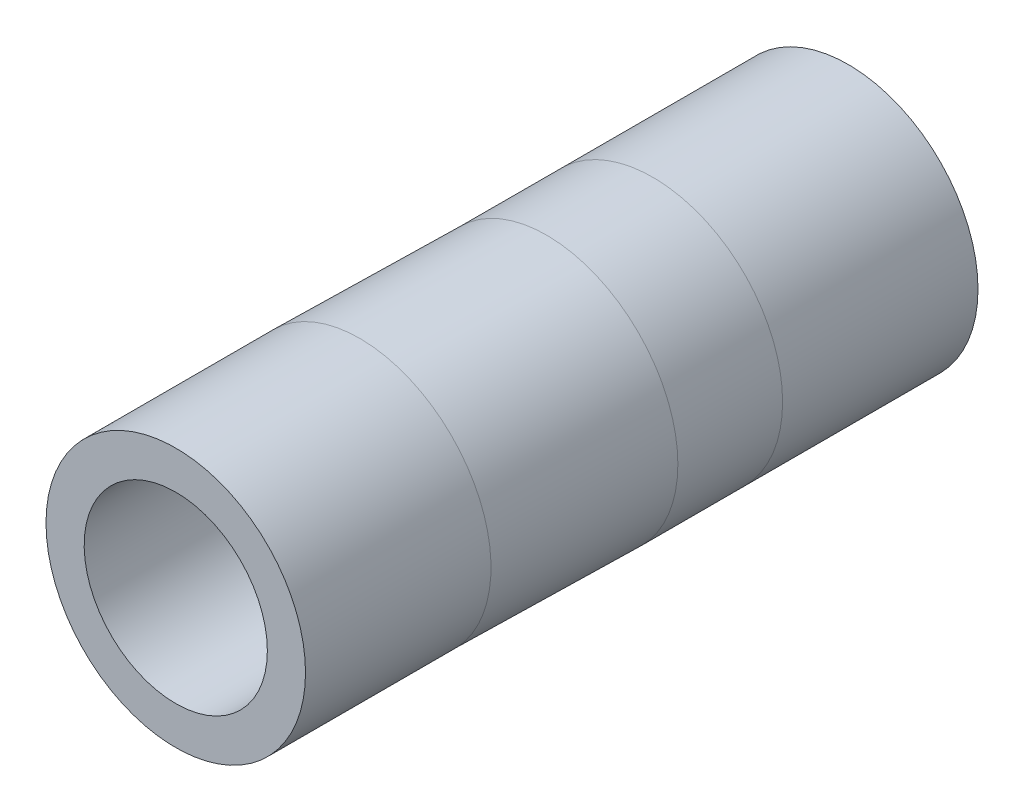
ISO-10303-21;
HEADER;
FILE_DESCRIPTION(('STEP AP214'),'2;1');
FILE_NAME('part.step','',(''),(''),'','','');
FILE_SCHEMA(('AUTOMOTIVE_DESIGN { 1 0 10303 214 1 1 1 1 }'));
ENDSEC;
DATA;
#1=APPLICATION_CONTEXT('core data for automotive mechanical design processes');
#2=APPLICATION_PROTOCOL_DEFINITION('international standard','automotive_design',2000,#1);
#3=PRODUCT_CONTEXT('',#1,'mechanical');
#4=PRODUCT('Part','Part','',(#3));
#5=PRODUCT_RELATED_PRODUCT_CATEGORY('part','',(#4));
#6=PRODUCT_DEFINITION_FORMATION('','',#4);
#7=PRODUCT_DEFINITION_CONTEXT('part definition',#1,'design');
#8=PRODUCT_DEFINITION('design','',#6,#7);
#9=PRODUCT_DEFINITION_SHAPE('','',#8);
#10=(LENGTH_UNIT() NAMED_UNIT(*) SI_UNIT(.MILLI.,.METRE.));
#11=(NAMED_UNIT(*) PLANE_ANGLE_UNIT() SI_UNIT($,.RADIAN.));
#12=(NAMED_UNIT(*) SI_UNIT($,.STERADIAN.) SOLID_ANGLE_UNIT());
#13=UNCERTAINTY_MEASURE_WITH_UNIT(LENGTH_MEASURE(1.E-05),#10,'distance_accuracy_value','');
#14=(GEOMETRIC_REPRESENTATION_CONTEXT(3) GLOBAL_UNCERTAINTY_ASSIGNED_CONTEXT((#13)) GLOBAL_UNIT_ASSIGNED_CONTEXT((#10,
#11,#12)) REPRESENTATION_CONTEXT('',''));
#15=CARTESIAN_POINT('',(0.,0.,0.));
#16=DIRECTION('',(0.,0.,1.));
#17=DIRECTION('',(1.,0.,0.));
#18=AXIS2_PLACEMENT_3D('',#15,#16,#17);
#19=CARTESIAN_POINT('',(-428.149950151648,-529.77578883125,-30.8991000000001));
#20=DIRECTION('',(0.,0.,1.));
#21=DIRECTION('',(1.,0.,0.));
#22=AXIS2_PLACEMENT_3D('',#19,#20,#21);
#23=PLANE('',#22);
#24=CARTESIAN_POINT('',(-428.149950151647,-529.77578883125,-30.8991000000001));
#25=DIRECTION('',(0.,0.,1.));
#26=DIRECTION('',(1.,0.,0.));
#27=AXIS2_PLACEMENT_3D('',#24,#25,#26);
#28=CIRCLE('',#27,9.52500000000001);
#29=CARTESIAN_POINT('',(-418.624950151647,-529.77578883125,-30.8991000000001));
#30=VERTEX_POINT('',#29);
#31=EDGE_CURVE('E98',#30,#30,#28,.T.);
#32=ORIENTED_EDGE('',*,*,#31,.T.);
#33=EDGE_LOOP('',(#32));
#34=FACE_BOUND('',#33,.T.);
#35=CARTESIAN_POINT('',(-428.149950151648,-529.77578883125,-30.8991000000001));
#36=DIRECTION('',(0.,0.,1.));
#37=DIRECTION('',(1.,0.,0.));
#38=AXIS2_PLACEMENT_3D('',#35,#36,#37);
#39=CIRCLE('',#38,13.49375);
#40=CARTESIAN_POINT('',(-414.656200151648,-529.77578883125,-30.8991000000001));
#41=VERTEX_POINT('',#40);
#42=EDGE_CURVE('E81',#41,#41,#39,.T.);
#43=ORIENTED_EDGE('',*,*,#42,.F.);
#44=EDGE_LOOP('',(#43));
#45=FACE_BOUND('',#44,.T.);
#46=ADVANCED_FACE('F60',(#34,#45),#23,.F.);
#47=CARTESIAN_POINT('',(-429.012409580605,-530.218903581321,38.1706173179638));
#48=DIRECTION('',(0.,0.,1.));
#49=DIRECTION('',(1.,0.,0.));
#50=AXIS2_PLACEMENT_3D('',#47,#48,#49);
#51=PLANE('',#50);
#52=CARTESIAN_POINT('',(-429.012409580605,-530.218903581321,38.1706173179638));
#53=DIRECTION('',(0.,0.,1.));
#54=DIRECTION('',(1.,0.,0.));
#55=AXIS2_PLACEMENT_3D('',#52,#53,#54);
#56=CIRCLE('',#55,9.52500000000001);
#57=CARTESIAN_POINT('',(-419.487409580605,-530.218903581321,38.1706173179638));
#58=VERTEX_POINT('',#57);
#59=EDGE_CURVE('E84',#58,#58,#56,.T.);
#60=ORIENTED_EDGE('',*,*,#59,.F.);
#61=EDGE_LOOP('',(#60));
#62=FACE_BOUND('',#61,.T.);
#63=CARTESIAN_POINT('',(-429.012409580605,-530.218903581321,38.1706173179638));
#64=DIRECTION('',(0.,0.,1.));
#65=DIRECTION('',(1.,0.,0.));
#66=AXIS2_PLACEMENT_3D('',#63,#64,#65);
#67=CIRCLE('',#66,13.49375);
#68=CARTESIAN_POINT('',(-415.518659580605,-530.218903581321,38.1706173179638));
#69=VERTEX_POINT('',#68);
#70=EDGE_CURVE('E68',#69,#69,#67,.T.);
#71=ORIENTED_EDGE('',*,*,#70,.T.);
#72=EDGE_LOOP('',(#71));
#73=FACE_BOUND('',#72,.T.);
#74=ADVANCED_FACE('F152',(#62,#73),#51,.T.);
#75=CARTESIAN_POINT('',(-428.149950151647,-529.77578883125,0.798429806321475));
#76=DIRECTION('',(0.,0.,-1.));
#77=DIRECTION('',(-1.,0.,0.));
#78=AXIS2_PLACEMENT_3D('',#75,#76,#77);
#79=CYLINDRICAL_SURFACE('',#78,13.49375);
#80=CARTESIAN_POINT('',(-428.149950151647,-529.77578883125,0.));
#81=DIRECTION('',(0.0231993471081752,0.0119193698283223,-0.999659801590846));
#82=DIRECTION('',(0.889167937515806,0.456837058271916,0.0260821985911831));
#83=AXIS2_PLACEMENT_3D('',#80,#81,#82);
#84=ELLIPSE('',#83,13.4983421145135,13.49375);
#85=CARTESIAN_POINT('',(-416.147657133802,-523.609245928107,0.352066439682501));
#86=VERTEX_POINT('',#85);
#87=EDGE_CURVE('E75',#86,#86,#84,.T.);
#88=ORIENTED_EDGE('',*,*,#87,.T.);
#89=EDGE_LOOP('',(#88));
#90=FACE_BOUND('',#89,.T.);
#91=CARTESIAN_POINT('',(-428.149950151647,-529.77578883125,-10.5791000000137));
#92=DIRECTION('',(0.,0.,1.));
#93=DIRECTION('',(1.,0.,0.));
#94=AXIS2_PLACEMENT_3D('',#91,#92,#93);
#95=CIRCLE('',#94,13.49375);
#96=CARTESIAN_POINT('',(-414.656200151647,-529.77578883125,-10.5791000000137));
#97=VERTEX_POINT('',#96);
#98=EDGE_CURVE('E63',#97,#97,#95,.T.);
#99=ORIENTED_EDGE('',*,*,#98,.T.);
#100=EDGE_LOOP('',(#99));
#101=FACE_BOUND('',#100,.T.);
#102=ADVANCED_FACE('F150',(#90,#101),#79,.T.);
#103=CARTESIAN_POINT('',(-428.149950151648,-529.77578883125,-10.5791));
#104=DIRECTION('',(0.,0.,-1.));
#105=DIRECTION('',(-1.,0.,0.));
#106=AXIS2_PLACEMENT_3D('',#103,#104,#105);
#107=CYLINDRICAL_SURFACE('',#106,13.49375);
#108=ORIENTED_EDGE('',*,*,#42,.T.);
#109=EDGE_LOOP('',(#108));
#110=FACE_BOUND('',#109,.T.);
#111=ORIENTED_EDGE('',*,*,#98,.F.);
#112=EDGE_LOOP('',(#111));
#113=FACE_BOUND('',#112,.T.);
#114=ADVANCED_FACE('F142',(#110,#113),#107,.T.);
#115=CARTESIAN_POINT('',(-429.049443078017,-530.237930666421,19.3663813005893));
#116=DIRECTION('',(0.0463829094544121,0.0238306297553371,-0.998639437833299));
#117=DIRECTION('',(-0.998923121793258,0.,-0.046396085468627));
#118=AXIS2_PLACEMENT_3D('',#115,#116,#117);
#119=CYLINDRICAL_SURFACE('',#118,13.49375);
#120=CARTESIAN_POINT('',(-429.012409580605,-530.218903581321,18.5690378076546));
#121=DIRECTION('',(0.0231993471081885,0.0119193698283194,-0.999659801590846));
#122=DIRECTION('',(-0.889167937515655,-0.45683705827221,-0.0260821985911937));
#123=AXIS2_PLACEMENT_3D('',#120,#121,#122);
#124=ELLIPSE('',#123,13.4983421145135,13.49375);
#125=CARTESIAN_POINT('',(-441.014702598448,-536.385446484468,18.216971367972));
#126=VERTEX_POINT('',#125);
#127=EDGE_CURVE('E11',#126,#126,#124,.T.);
#128=ORIENTED_EDGE('',*,*,#127,.T.);
#129=EDGE_LOOP('',(#128));
#130=FACE_BOUND('',#129,.T.);
#131=ORIENTED_EDGE('',*,*,#87,.F.);
#132=EDGE_LOOP('',(#131));
#133=FACE_BOUND('',#132,.T.);
#134=ADVANCED_FACE('F136',(#130,#133),#119,.T.);
#135=CARTESIAN_POINT('',(-429.012409580605,-530.218903581321,38.1706173179638));
#136=DIRECTION('',(0.,0.,-1.));
#137=DIRECTION('',(-1.,0.,0.));
#138=AXIS2_PLACEMENT_3D('',#135,#136,#137);
#139=CYLINDRICAL_SURFACE('',#138,13.49375);
#140=ORIENTED_EDGE('',*,*,#70,.F.);
#141=EDGE_LOOP('',(#140));
#142=FACE_BOUND('',#141,.T.);
#143=ORIENTED_EDGE('',*,*,#127,.F.);
#144=EDGE_LOOP('',(#143));
#145=FACE_BOUND('',#144,.T.);
#146=ADVANCED_FACE('F131',(#142,#145),#139,.T.);
#147=CARTESIAN_POINT('',(-429.012409580605,-530.218903581321,43.1706173179685));
#148=DIRECTION('',(0.,0.,-1.));
#149=DIRECTION('',(-1.,0.,0.));
#150=AXIS2_PLACEMENT_3D('',#147,#148,#149);
#151=CYLINDRICAL_SURFACE('',#150,9.52500000000001);
#152=CARTESIAN_POINT('',(-429.012409580605,-530.218903581321,18.5690378076546));
#153=DIRECTION('',(0.0231993471081891,0.0119193698283223,-0.999659801590846));
#154=DIRECTION('',(-0.889167937515624,-0.456837058272269,-0.0260821985911955));
#155=AXIS2_PLACEMENT_3D('',#152,#153,#154);
#156=ELLIPSE('',#155,9.52824149259782,9.52500000000001);
#157=CARTESIAN_POINT('',(-437.484616416729,-534.571757395308,18.3205203208198));
#158=VERTEX_POINT('',#157);
#159=EDGE_CURVE('E92',#158,#158,#156,.T.);
#160=ORIENTED_EDGE('',*,*,#159,.T.);
#161=EDGE_LOOP('',(#160));
#162=FACE_BOUND('',#161,.T.);
#163=ORIENTED_EDGE('',*,*,#59,.T.);
#164=EDGE_LOOP('',(#163));
#165=FACE_BOUND('',#164,.T.);
#166=ADVANCED_FACE('F125',(#162,#165),#151,.F.);
#167=CARTESIAN_POINT('',(-428.149950151647,-529.77578883125,0.593009275050748));
#168=DIRECTION('',(0.,0.,-1.));
#169=DIRECTION('',(-1.,0.,0.));
#170=AXIS2_PLACEMENT_3D('',#167,#168,#169);
#171=CYLINDRICAL_SURFACE('',#170,9.52500000000001);
#172=CARTESIAN_POINT('',(-428.149950151647,-529.77578883125,0.));
#173=DIRECTION('',(0.0231993471081752,0.0119193698283223,-0.999659801590846));
#174=DIRECTION('',(0.889167937515806,0.456837058271916,0.0260821985911831));
#175=AXIS2_PLACEMENT_3D('',#172,#173,#174);
#176=ELLIPSE('',#175,9.52824149259782,9.52500000000001);
#177=CARTESIAN_POINT('',(-419.677743315521,-525.422935017267,0.248517486834708));
#178=VERTEX_POINT('',#177);
#179=EDGE_CURVE('E101',#178,#178,#176,.T.);
#180=ORIENTED_EDGE('',*,*,#179,.F.);
#181=EDGE_LOOP('',(#180));
#182=FACE_BOUND('',#181,.T.);
#183=CARTESIAN_POINT('',(-428.149950151647,-529.77578883125,-10.5791000000125));
#184=DIRECTION('',(0.,0.,1.));
#185=DIRECTION('',(1.,0.,0.));
#186=AXIS2_PLACEMENT_3D('',#183,#184,#185);
#187=CIRCLE('',#186,9.52500000000001);
#188=CARTESIAN_POINT('',(-418.624950151647,-529.77578883125,-10.5791000000125));
#189=VERTEX_POINT('',#188);
#190=EDGE_CURVE('E105',#189,#189,#187,.T.);
#191=ORIENTED_EDGE('',*,*,#190,.F.);
#192=EDGE_LOOP('',(#191));
#193=FACE_BOUND('',#192,.T.);
#194=ADVANCED_FACE('F120',(#182,#193),#171,.F.);
#195=CARTESIAN_POINT('',(-428.149950151647,-529.77578883125,-10.579100000014));
#196=DIRECTION('',(0.,0.,-1.));
#197=DIRECTION('',(-1.,0.,0.));
#198=AXIS2_PLACEMENT_3D('',#195,#196,#197);
#199=CYLINDRICAL_SURFACE('',#198,9.52500000000001);
#200=ORIENTED_EDGE('',*,*,#31,.F.);
#201=EDGE_LOOP('',(#200));
#202=FACE_BOUND('',#201,.T.);
#203=ORIENTED_EDGE('',*,*,#190,.T.);
#204=EDGE_LOOP('',(#203));
#205=FACE_BOUND('',#204,.T.);
#206=ADVANCED_FACE('F116',(#202,#205),#199,.F.);
#207=CARTESIAN_POINT('',(-429.039915076115,-530.233035365797,19.1612402567215));
#208=DIRECTION('',(0.0463829094544121,0.0238306297553371,-0.998639437833299));
#209=DIRECTION('',(-0.998923121793258,0.,-0.046396085468627));
#210=AXIS2_PLACEMENT_3D('',#207,#208,#209);
#211=CYLINDRICAL_SURFACE('',#210,9.52500000000001);
#212=ORIENTED_EDGE('',*,*,#159,.F.);
#213=EDGE_LOOP('',(#212));
#214=FACE_BOUND('',#213,.T.);
#215=ORIENTED_EDGE('',*,*,#179,.T.);
#216=EDGE_LOOP('',(#215));
#217=FACE_BOUND('',#216,.T.);
#218=ADVANCED_FACE('F119',(#214,#217),#211,.F.);
#219=CLOSED_SHELL('',(#46,#74,#102,#114,#134,#146,#166,#194,#206,#218));
#220=MANIFOLD_SOLID_BREP('B2',#219);
#221=ADVANCED_BREP_SHAPE_REPRESENTATION('',(#18,#220),#14);
#222=SHAPE_DEFINITION_REPRESENTATION(#9,#221);
ENDSEC;
END-ISO-10303-21;
